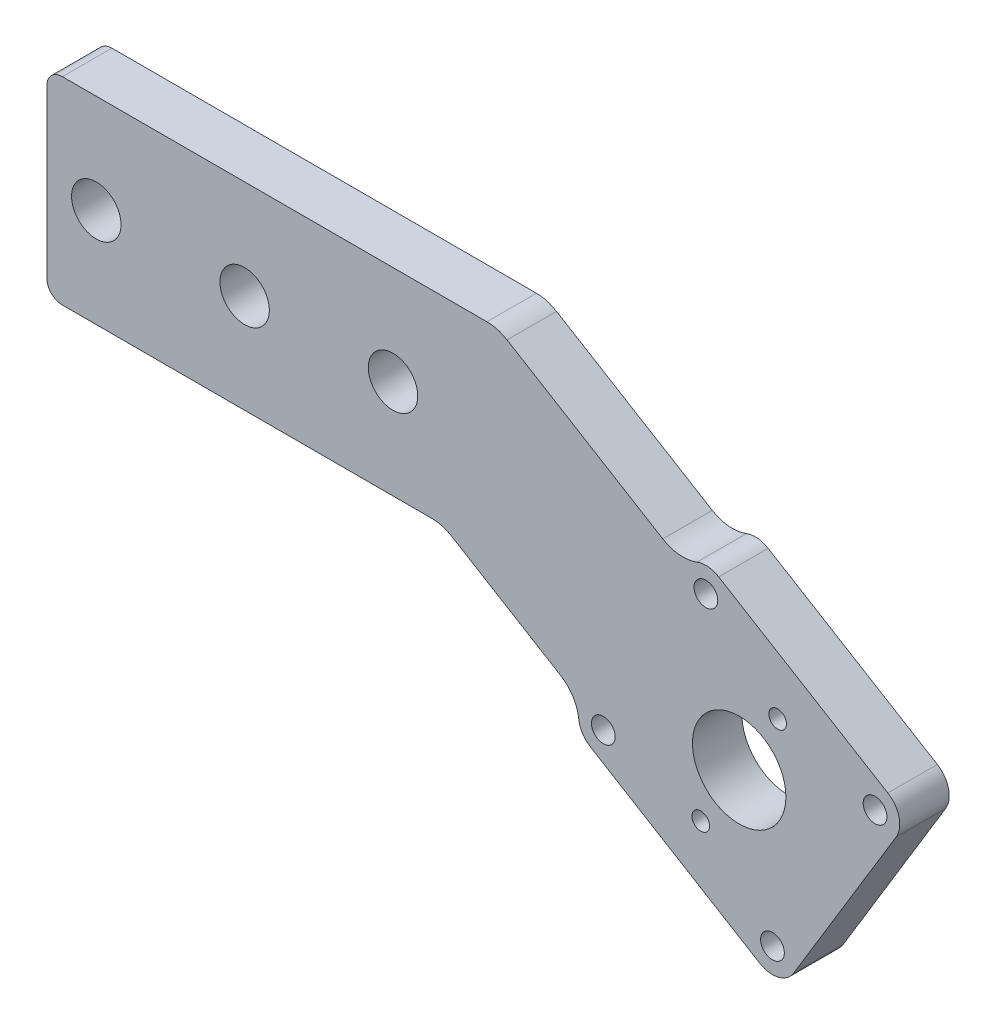
ISO-10303-21;
HEADER;
FILE_DESCRIPTION(('STEP AP214'),'2;1');
FILE_NAME('part.step','',(''),(''),'','','');
FILE_SCHEMA(('AUTOMOTIVE_DESIGN { 1 0 10303 214 1 1 1 1 }'));
ENDSEC;
DATA;
#1=APPLICATION_CONTEXT('core data for automotive mechanical design processes');
#2=APPLICATION_PROTOCOL_DEFINITION('international standard','automotive_design',2000,#1);
#3=PRODUCT_CONTEXT('',#1,'mechanical');
#4=PRODUCT('Part','Part','',(#3));
#5=PRODUCT_RELATED_PRODUCT_CATEGORY('part','',(#4));
#6=PRODUCT_DEFINITION_FORMATION('','',#4);
#7=PRODUCT_DEFINITION_CONTEXT('part definition',#1,'design');
#8=PRODUCT_DEFINITION('design','',#6,#7);
#9=PRODUCT_DEFINITION_SHAPE('','',#8);
#10=(LENGTH_UNIT() NAMED_UNIT(*) SI_UNIT(.MILLI.,.METRE.));
#11=(NAMED_UNIT(*) PLANE_ANGLE_UNIT() SI_UNIT($,.RADIAN.));
#12=(NAMED_UNIT(*) SI_UNIT($,.STERADIAN.) SOLID_ANGLE_UNIT());
#13=UNCERTAINTY_MEASURE_WITH_UNIT(LENGTH_MEASURE(1.E-05),#10,'distance_accuracy_value','');
#14=(GEOMETRIC_REPRESENTATION_CONTEXT(3) GLOBAL_UNCERTAINTY_ASSIGNED_CONTEXT((#13)) GLOBAL_UNIT_ASSIGNED_CONTEXT((#10,
#11,#12)) REPRESENTATION_CONTEXT('',''));
#15=CARTESIAN_POINT('',(0.,0.,0.));
#16=DIRECTION('',(0.,0.,1.));
#17=DIRECTION('',(1.,0.,0.));
#18=AXIS2_PLACEMENT_3D('',#15,#16,#17);
#19=CARTESIAN_POINT('',(33.8252466050733,-3.50561742529808,6.35));
#20=DIRECTION('',(0.,0.,1.));
#21=DIRECTION('',(1.,0.,0.));
#22=AXIS2_PLACEMENT_3D('',#19,#20,#21);
#23=PLANE('',#22);
#24=CARTESIAN_POINT('',(42.3747533949267,-38.3943825747018,6.35));
#25=DIRECTION('',(0.,0.,1.));
#26=DIRECTION('',(1.,0.,0.));
#27=AXIS2_PLACEMENT_3D('',#24,#25,#26);
#28=CIRCLE('',#27,1.52399999999997);
#29=CARTESIAN_POINT('',(43.8987533949267,-38.3943825747018,6.35));
#30=VERTEX_POINT('',#29);
#31=EDGE_CURVE('E354',#30,#30,#28,.T.);
#32=ORIENTED_EDGE('',*,*,#31,.F.);
#33=EDGE_LOOP('',(#32));
#34=FACE_BOUND('',#33,.T.);
#35=CARTESIAN_POINT('',(-44.45,0.,6.35));
#36=DIRECTION('',(0.,0.,1.));
#37=DIRECTION('',(1.,0.,0.));
#38=AXIS2_PLACEMENT_3D('',#35,#36,#37);
#39=CIRCLE('',#38,3.175);
#40=CARTESIAN_POINT('',(-41.275,0.,6.35));
#41=VERTEX_POINT('',#40);
#42=EDGE_CURVE('E342',#41,#41,#39,.T.);
#43=ORIENTED_EDGE('',*,*,#42,.F.);
#44=EDGE_LOOP('',(#43));
#45=FACE_BOUND('',#44,.T.);
#46=CARTESIAN_POINT('',(-6.35,0.,6.35));
#47=DIRECTION('',(0.,0.,1.));
#48=DIRECTION('',(1.,0.,0.));
#49=AXIS2_PLACEMENT_3D('',#46,#47,#48);
#50=CIRCLE('',#49,3.175);
#51=CARTESIAN_POINT('',(-3.17500000000001,0.,6.35));
#52=VERTEX_POINT('',#51);
#53=EDGE_CURVE('E330',#52,#52,#50,.T.);
#54=ORIENTED_EDGE('',*,*,#53,.F.);
#55=EDGE_LOOP('',(#54));
#56=FACE_BOUND('',#55,.T.);
#57=CARTESIAN_POINT('',(43.0386109424157,-12.8053240113892,6.35));
#58=DIRECTION('',(0.,0.,1.));
#59=DIRECTION('',(1.,0.,0.));
#60=AXIS2_PLACEMENT_3D('',#57,#58,#59);
#61=CIRCLE('',#60,1.13030000000011);
#62=CARTESIAN_POINT('',(44.1689109424158,-12.8053240113892,6.35));
#63=VERTEX_POINT('',#62);
#64=EDGE_CURVE('E318',#63,#63,#61,.T.);
#65=ORIENTED_EDGE('',*,*,#64,.F.);
#66=EDGE_LOOP('',(#65));
#67=FACE_BOUND('',#66,.T.);
#68=CARTESIAN_POINT('',(38.1,-20.95,6.35));
#69=DIRECTION('',(0.,0.,1.));
#70=DIRECTION('',(1.,0.,0.));
#71=AXIS2_PLACEMENT_3D('',#68,#69,#70);
#72=CIRCLE('',#71,6.);
#73=CARTESIAN_POINT('',(44.1,-20.95,6.35));
#74=VERTEX_POINT('',#73);
#75=EDGE_CURVE('E213',#74,#74,#72,.T.);
#76=ORIENTED_EDGE('',*,*,#75,.F.);
#77=EDGE_LOOP('',(#76));
#78=FACE_BOUND('',#77,.T.);
#79=DIRECTION('',(-0.855084093292464,0.518489337786425,0.));
#80=VECTOR('',#79,1.);
#81=CARTESIAN_POINT('',(31.1103546088691,-1.85941377782577,6.35));
#82=LINE('',#81,#80);
#83=CARTESIAN_POINT('',(28.2948534761296,-0.15220470996661,6.35));
#84=VERTEX_POINT('',#83);
#85=CARTESIAN_POINT('',(8.29417338104687,11.9754204664623,6.35));
#86=VERTEX_POINT('',#85);
#87=EDGE_CURVE('E170',#84,#86,#82,.T.);
#88=ORIENTED_EDGE('',*,*,#87,.T.);
#89=CARTESIAN_POINT('',(5.70172669211474,7.70000000000001,6.35));
#90=DIRECTION('',(0.,0.,1.));
#91=DIRECTION('',(1.,0.,0.));
#92=AXIS2_PLACEMENT_3D('',#89,#90,#91);
#93=CIRCLE('',#92,5.);
#94=CARTESIAN_POINT('',(5.70172669211474,12.7,6.35));
#95=VERTEX_POINT('',#94);
#96=EDGE_CURVE('E166',#86,#95,#93,.T.);
#97=ORIENTED_EDGE('',*,*,#96,.T.);
#98=DIRECTION('',(-1.,0.,0.));
#99=VECTOR('',#98,1.);
#100=CARTESIAN_POINT('',(7.0992087244958,12.7,6.35));
#101=LINE('',#100,#99);
#102=CARTESIAN_POINT('',(-48.8,12.7,6.35));
#103=VERTEX_POINT('',#102);
#104=EDGE_CURVE('E158',#95,#103,#101,.T.);
#105=ORIENTED_EDGE('',*,*,#104,.T.);
#106=CARTESIAN_POINT('',(-48.8,10.7,6.35));
#107=DIRECTION('',(0.,0.,1.));
#108=DIRECTION('',(1.,0.,0.));
#109=AXIS2_PLACEMENT_3D('',#106,#107,#108);
#110=CIRCLE('',#109,1.99999999999999);
#111=CARTESIAN_POINT('',(-50.8,10.7,6.35));
#112=VERTEX_POINT('',#111);
#113=EDGE_CURVE('E163',#103,#112,#110,.T.);
#114=ORIENTED_EDGE('',*,*,#113,.T.);
#115=DIRECTION('',(0.,-1.,0.));
#116=VECTOR('',#115,1.);
#117=CARTESIAN_POINT('',(-50.8,10.7,6.35));
#118=LINE('',#117,#116);
#119=CARTESIAN_POINT('',(-50.8,-10.7,6.35));
#120=VERTEX_POINT('',#119);
#121=EDGE_CURVE('E185',#112,#120,#118,.T.);
#122=ORIENTED_EDGE('',*,*,#121,.T.);
#123=CARTESIAN_POINT('',(-48.8,-10.7,6.35));
#124=DIRECTION('',(0.,0.,1.));
#125=DIRECTION('',(-1.,0.,0.));
#126=AXIS2_PLACEMENT_3D('',#123,#124,#125);
#127=CIRCLE('',#126,1.99999999999999);
#128=CARTESIAN_POINT('',(-48.8,-12.7,6.35));
#129=VERTEX_POINT('',#128);
#130=EDGE_CURVE('E187',#120,#129,#127,.T.);
#131=ORIENTED_EDGE('',*,*,#130,.T.);
#132=DIRECTION('',(1.,0.,0.));
#133=VECTOR('',#132,1.);
#134=CARTESIAN_POINT('',(-48.8,-12.7,6.35));
#135=LINE('',#134,#133);
#136=CARTESIAN_POINT('',(-1.39748203238105,-12.7,6.35));
#137=VERTEX_POINT('',#136);
#138=EDGE_CURVE('E192',#129,#137,#135,.T.);
#139=ORIENTED_EDGE('',*,*,#138,.T.);
#140=CARTESIAN_POINT('',(-1.39748203238106,-17.7,6.35));
#141=DIRECTION('',(0.,0.,1.));
#142=DIRECTION('',(1.,0.,0.));
#143=AXIS2_PLACEMENT_3D('',#140,#141,#142);
#144=CIRCLE('',#143,5.);
#145=CARTESIAN_POINT('',(1.19496465655107,-13.4245795335377,6.35));
#146=VERTEX_POINT('',#145);
#147=EDGE_CURVE('E288',#137,#146,#144,.F.);
#148=ORIENTED_EDGE('',*,*,#147,.T.);
#149=DIRECTION('',(0.855084093292463,-0.518489337786425,0.));
#150=VECTOR('',#149,1.);
#151=CARTESIAN_POINT('',(17.9407254290939,-23.5785497474544,6.35));
#152=LINE('',#151,#150);
#153=CARTESIAN_POINT('',(15.125224296355,-21.8713406795956,6.35));
#154=VERTEX_POINT('',#153);
#155=EDGE_CURVE('E195',#146,#154,#152,.T.);
#156=ORIENTED_EDGE('',*,*,#155,.T.);
#157=CARTESIAN_POINT('',(12.5327776074229,-26.1467611460579,6.35));
#158=DIRECTION('',(0.,0.,1.));
#159=DIRECTION('',(1.,0.,0.));
#160=AXIS2_PLACEMENT_3D('',#157,#158,#159);
#161=CIRCLE('',#160,5.);
#162=CARTESIAN_POINT('',(17.5008753553586,-25.5828420322162,6.35));
#163=VERTEX_POINT('',#162);
#164=EDGE_CURVE('E48',#154,#163,#161,.F.);
#165=ORIENTED_EDGE('',*,*,#164,.T.);
#166=CARTESIAN_POINT('',(20.6556174252981,-25.2247533949267,6.35));
#167=DIRECTION('',(0.,0.,1.));
#168=DIRECTION('',(-1.,0.,0.));
#169=AXIS2_PLACEMENT_3D('',#166,#167,#168);
#170=CIRCLE('',#169,3.17500000000037);
#171=CARTESIAN_POINT('',(19.0094142342208,-27.9396456678703,6.35));
#172=VERTEX_POINT('',#171);
#173=EDGE_CURVE('E197',#163,#172,#170,.T.);
#174=ORIENTED_EDGE('',*,*,#173,.T.);
#175=DIRECTION('',(0.855084093292464,-0.518489337786424,0.));
#176=VECTOR('',#175,1.);
#177=CARTESIAN_POINT('',(40.7285502038496,-41.1092748476451,6.35));
#178=LINE('',#177,#176);
#179=CARTESIAN_POINT('',(40.7285502038496,-41.1092748476451,6.35));
#180=VERTEX_POINT('',#179);
#181=EDGE_CURVE('E199',#172,#180,#178,.T.);
#182=ORIENTED_EDGE('',*,*,#181,.T.);
#183=CARTESIAN_POINT('',(42.3747533949267,-38.3943825747018,6.35));
#184=DIRECTION('',(0.,0.,1.));
#185=DIRECTION('',(-1.,0.,0.));
#186=AXIS2_PLACEMENT_3D('',#183,#184,#185);
#187=CIRCLE('',#186,3.17499999999999);
#188=CARTESIAN_POINT('',(45.0896455688839,-40.0405859290254,6.35));
#189=VERTEX_POINT('',#188);
#190=EDGE_CURVE('E201',#180,#189,#187,.T.);
#191=ORIENTED_EDGE('',*,*,#190,.T.);
#192=DIRECTION('',(0.518489337786426,0.855084093292463,0.));
#193=VECTOR('',#192,1.);
#194=CARTESIAN_POINT('',(58.2592747486591,-18.3214499593968,6.35));
#195=LINE('',#194,#193);
#196=CARTESIAN_POINT('',(58.2592747486591,-18.3214499593968,6.35));
#197=VERTEX_POINT('',#196);
#198=EDGE_CURVE('E203',#189,#197,#195,.T.);
#199=ORIENTED_EDGE('',*,*,#198,.T.);
#200=CARTESIAN_POINT('',(55.5443825747019,-16.6752466050732,6.35));
#201=DIRECTION('',(0.,0.,1.));
#202=DIRECTION('',(-1.,0.,0.));
#203=AXIS2_PLACEMENT_3D('',#200,#201,#202);
#204=CIRCLE('',#203,3.17500000000053);
#205=CARTESIAN_POINT('',(57.1905882999451,-13.9603558687489,6.35));
#206=VERTEX_POINT('',#205);
#207=EDGE_CURVE('E205',#197,#206,#204,.T.);
#208=ORIENTED_EDGE('',*,*,#207,.T.);
#209=DIRECTION('',(-0.855084093292463,0.518489337786426,0.));
#210=VECTOR('',#209,1.);
#211=CARTESIAN_POINT('',(57.1905882999454,-13.9603558687485,6.35));
#212=LINE('',#211,#210);
#213=CARTESIAN_POINT('',(35.4714523303168,-0.790726688973308,6.35));
#214=VERTEX_POINT('',#213);
#215=EDGE_CURVE('E207',#206,#214,#212,.T.);
#216=ORIENTED_EDGE('',*,*,#215,.T.);
#217=CARTESIAN_POINT('',(33.8252466050733,-3.50561742529808,6.35));
#218=DIRECTION('',(0.,0.,1.));
#219=DIRECTION('',(1.,0.,0.));
#220=AXIS2_PLACEMENT_3D('',#217,#218,#219);
#221=CIRCLE('',#220,3.17500000000088);
#222=CARTESIAN_POINT('',(32.6842093026833,-0.542737259891424,6.35));
#223=VERTEX_POINT('',#222);
#224=EDGE_CURVE('E241',#214,#223,#221,.T.);
#225=ORIENTED_EDGE('',*,*,#224,.T.);
#226=CARTESIAN_POINT('',(30.8873001650618,4.12321575649571,6.35));
#227=DIRECTION('',(0.,0.,1.));
#228=DIRECTION('',(1.,0.,0.));
#229=AXIS2_PLACEMENT_3D('',#226,#227,#228);
#230=CIRCLE('',#229,5.);
#231=EDGE_CURVE('E11',#223,#84,#230,.F.);
#232=ORIENTED_EDGE('',*,*,#231,.T.);
#233=EDGE_LOOP('',(#88,#97,#105,#114,#122,#131,#139,#148,#156,#165,#174,#182,#191,#199,#208,
#216,#225,#232));
#234=FACE_BOUND('',#233,.T.);
#235=CARTESIAN_POINT('',(33.8252466050733,-3.50561742529808,6.35));
#236=DIRECTION('',(0.,0.,1.));
#237=DIRECTION('',(1.,0.,0.));
#238=AXIS2_PLACEMENT_3D('',#235,#236,#237);
#239=CIRCLE('',#238,1.52400000000001);
#240=CARTESIAN_POINT('',(35.3492466050733,-3.50561742529808,6.35));
#241=VERTEX_POINT('',#240);
#242=EDGE_CURVE('E312',#241,#241,#239,.T.);
#243=ORIENTED_EDGE('',*,*,#242,.F.);
#244=EDGE_LOOP('',(#243));
#245=FACE_BOUND('',#244,.T.);
#246=CARTESIAN_POINT('',(33.1613890575843,-29.0946759886107,6.35));
#247=DIRECTION('',(0.,0.,1.));
#248=DIRECTION('',(1.,0.,0.));
#249=AXIS2_PLACEMENT_3D('',#246,#247,#248);
#250=CIRCLE('',#249,1.13030000000002);
#251=CARTESIAN_POINT('',(34.2916890575843,-29.0946759886107,6.35));
#252=VERTEX_POINT('',#251);
#253=EDGE_CURVE('E324',#252,#252,#250,.T.);
#254=ORIENTED_EDGE('',*,*,#253,.F.);
#255=EDGE_LOOP('',(#254));
#256=FACE_BOUND('',#255,.T.);
#257=CARTESIAN_POINT('',(-25.4,0.,6.35));
#258=DIRECTION('',(0.,0.,1.));
#259=DIRECTION('',(1.,0.,0.));
#260=AXIS2_PLACEMENT_3D('',#257,#258,#259);
#261=CIRCLE('',#260,3.175);
#262=CARTESIAN_POINT('',(-22.225,0.,6.35));
#263=VERTEX_POINT('',#262);
#264=EDGE_CURVE('E336',#263,#263,#261,.T.);
#265=ORIENTED_EDGE('',*,*,#264,.F.);
#266=EDGE_LOOP('',(#265));
#267=FACE_BOUND('',#266,.T.);
#268=CARTESIAN_POINT('',(20.6556174252981,-25.2247533949267,6.35));
#269=DIRECTION('',(0.,0.,1.));
#270=DIRECTION('',(1.,0.,0.));
#271=AXIS2_PLACEMENT_3D('',#268,#269,#270);
#272=CIRCLE('',#271,1.52399999999999);
#273=CARTESIAN_POINT('',(22.1796174252981,-25.2247533949267,6.35));
#274=VERTEX_POINT('',#273);
#275=EDGE_CURVE('E348',#274,#274,#272,.T.);
#276=ORIENTED_EDGE('',*,*,#275,.F.);
#277=EDGE_LOOP('',(#276));
#278=FACE_BOUND('',#277,.T.);
#279=CARTESIAN_POINT('',(55.5443825747019,-16.6752466050732,6.35));
#280=DIRECTION('',(0.,0.,1.));
#281=DIRECTION('',(1.,0.,0.));
#282=AXIS2_PLACEMENT_3D('',#279,#280,#281);
#283=CIRCLE('',#282,1.524);
#284=CARTESIAN_POINT('',(57.0683825747019,-16.6752466050732,6.35));
#285=VERTEX_POINT('',#284);
#286=EDGE_CURVE('E360',#285,#285,#283,.T.);
#287=ORIENTED_EDGE('',*,*,#286,.F.);
#288=EDGE_LOOP('',(#287));
#289=FACE_BOUND('',#288,.T.);
#290=ADVANCED_FACE('F33',(#34,#45,#56,#67,#78,#234,#245,#256,#267,#278,#289),#23,.T.);
#291=CARTESIAN_POINT('',(33.8252466050733,-3.50561742529808,0.));
#292=DIRECTION('',(0.,0.,1.));
#293=DIRECTION('',(1.,0.,0.));
#294=AXIS2_PLACEMENT_3D('',#291,#292,#293);
#295=PLANE('',#294);
#296=DIRECTION('',(-1.,0.,0.));
#297=VECTOR('',#296,1.);
#298=CARTESIAN_POINT('',(7.0992087244958,12.7,0.));
#299=LINE('',#298,#297);
#300=CARTESIAN_POINT('',(5.70172669211474,12.7,0.));
#301=VERTEX_POINT('',#300);
#302=CARTESIAN_POINT('',(-48.8,12.7,0.));
#303=VERTEX_POINT('',#302);
#304=EDGE_CURVE('E176',#301,#303,#299,.T.);
#305=ORIENTED_EDGE('',*,*,#304,.F.);
#306=CARTESIAN_POINT('',(5.70172669211474,7.70000000000001,0.));
#307=DIRECTION('',(0.,0.,1.));
#308=DIRECTION('',(1.,0.,0.));
#309=AXIS2_PLACEMENT_3D('',#306,#307,#308);
#310=CIRCLE('',#309,5.);
#311=CARTESIAN_POINT('',(8.29417338104687,11.9754204664623,0.));
#312=VERTEX_POINT('',#311);
#313=EDGE_CURVE('E274',#301,#312,#310,.F.);
#314=ORIENTED_EDGE('',*,*,#313,.T.);
#315=DIRECTION('',(-0.855084093292464,0.518489337786425,0.));
#316=VECTOR('',#315,1.);
#317=CARTESIAN_POINT('',(31.1103546088691,-1.85941377782577,0.));
#318=LINE('',#317,#316);
#319=CARTESIAN_POINT('',(28.2948534761296,-0.15220470996661,0.));
#320=VERTEX_POINT('',#319);
#321=EDGE_CURVE('E212',#320,#312,#318,.T.);
#322=ORIENTED_EDGE('',*,*,#321,.F.);
#323=CARTESIAN_POINT('',(30.8873001650618,4.12321575649571,0.));
#324=DIRECTION('',(0.,0.,1.));
#325=DIRECTION('',(1.,0.,0.));
#326=AXIS2_PLACEMENT_3D('',#323,#324,#325);
#327=CIRCLE('',#326,5.);
#328=CARTESIAN_POINT('',(32.6842093026833,-0.542737259891424,0.));
#329=VERTEX_POINT('',#328);
#330=EDGE_CURVE('E41',#320,#329,#327,.T.);
#331=ORIENTED_EDGE('',*,*,#330,.T.);
#332=CARTESIAN_POINT('',(33.8252466050733,-3.50561742529808,0.));
#333=DIRECTION('',(0.,0.,1.));
#334=DIRECTION('',(1.,0.,0.));
#335=AXIS2_PLACEMENT_3D('',#332,#333,#334);
#336=CIRCLE('',#335,3.17500000000088);
#337=CARTESIAN_POINT('',(35.4714523303168,-0.790726688973308,0.));
#338=VERTEX_POINT('',#337);
#339=EDGE_CURVE('E210',#338,#329,#336,.T.);
#340=ORIENTED_EDGE('',*,*,#339,.F.);
#341=DIRECTION('',(-0.855084093292463,0.518489337786426,0.));
#342=VECTOR('',#341,1.);
#343=CARTESIAN_POINT('',(57.1905882999454,-13.9603558687485,0.));
#344=LINE('',#343,#342);
#345=CARTESIAN_POINT('',(57.1905882999451,-13.9603558687489,0.));
#346=VERTEX_POINT('',#345);
#347=EDGE_CURVE('E239',#346,#338,#344,.T.);
#348=ORIENTED_EDGE('',*,*,#347,.F.);
#349=CARTESIAN_POINT('',(55.5443825747019,-16.6752466050732,0.));
#350=DIRECTION('',(0.,0.,1.));
#351=DIRECTION('',(-1.,0.,0.));
#352=AXIS2_PLACEMENT_3D('',#349,#350,#351);
#353=CIRCLE('',#352,3.17500000000053);
#354=CARTESIAN_POINT('',(58.2592747486591,-18.3214499593968,0.));
#355=VERTEX_POINT('',#354);
#356=EDGE_CURVE('E237',#355,#346,#353,.T.);
#357=ORIENTED_EDGE('',*,*,#356,.F.);
#358=DIRECTION('',(0.518489337786426,0.855084093292463,0.));
#359=VECTOR('',#358,1.);
#360=CARTESIAN_POINT('',(58.2592747486591,-18.3214499593968,0.));
#361=LINE('',#360,#359);
#362=CARTESIAN_POINT('',(45.0896455688839,-40.0405859290254,0.));
#363=VERTEX_POINT('',#362);
#364=EDGE_CURVE('E235',#363,#355,#361,.T.);
#365=ORIENTED_EDGE('',*,*,#364,.F.);
#366=CARTESIAN_POINT('',(42.3747533949267,-38.3943825747018,0.));
#367=DIRECTION('',(0.,0.,1.));
#368=DIRECTION('',(-1.,0.,0.));
#369=AXIS2_PLACEMENT_3D('',#366,#367,#368);
#370=CIRCLE('',#369,3.17499999999999);
#371=CARTESIAN_POINT('',(40.7285502038496,-41.1092748476451,0.));
#372=VERTEX_POINT('',#371);
#373=EDGE_CURVE('E233',#372,#363,#370,.T.);
#374=ORIENTED_EDGE('',*,*,#373,.F.);
#375=DIRECTION('',(0.855084093292464,-0.518489337786424,0.));
#376=VECTOR('',#375,1.);
#377=CARTESIAN_POINT('',(40.7285502038496,-41.1092748476451,0.));
#378=LINE('',#377,#376);
#379=CARTESIAN_POINT('',(19.0094142342208,-27.9396456678703,0.));
#380=VERTEX_POINT('',#379);
#381=EDGE_CURVE('E231',#380,#372,#378,.T.);
#382=ORIENTED_EDGE('',*,*,#381,.F.);
#383=CARTESIAN_POINT('',(20.6556174252981,-25.2247533949267,0.));
#384=DIRECTION('',(0.,0.,1.));
#385=DIRECTION('',(-1.,0.,0.));
#386=AXIS2_PLACEMENT_3D('',#383,#384,#385);
#387=CIRCLE('',#386,3.17500000000037);
#388=CARTESIAN_POINT('',(17.5008753553586,-25.5828420322162,0.));
#389=VERTEX_POINT('',#388);
#390=EDGE_CURVE('E229',#389,#380,#387,.T.);
#391=ORIENTED_EDGE('',*,*,#390,.F.);
#392=CARTESIAN_POINT('',(12.5327776074229,-26.1467611460579,0.));
#393=DIRECTION('',(0.,0.,1.));
#394=DIRECTION('',(1.,0.,0.));
#395=AXIS2_PLACEMENT_3D('',#392,#393,#394);
#396=CIRCLE('',#395,5.);
#397=CARTESIAN_POINT('',(15.125224296355,-21.8713406795956,0.));
#398=VERTEX_POINT('',#397);
#399=EDGE_CURVE('E290',#389,#398,#396,.T.);
#400=ORIENTED_EDGE('',*,*,#399,.T.);
#401=DIRECTION('',(0.855084093292463,-0.518489337786425,0.));
#402=VECTOR('',#401,1.);
#403=CARTESIAN_POINT('',(17.9407254290939,-23.5785497474544,0.));
#404=LINE('',#403,#402);
#405=CARTESIAN_POINT('',(1.19496465655107,-13.4245795335377,0.));
#406=VERTEX_POINT('',#405);
#407=EDGE_CURVE('E226',#406,#398,#404,.T.);
#408=ORIENTED_EDGE('',*,*,#407,.F.);
#409=CARTESIAN_POINT('',(-1.39748203238106,-17.7,0.));
#410=DIRECTION('',(0.,0.,1.));
#411=DIRECTION('',(1.,0.,0.));
#412=AXIS2_PLACEMENT_3D('',#409,#410,#411);
#413=CIRCLE('',#412,5.);
#414=CARTESIAN_POINT('',(-1.39748203238105,-12.7,0.));
#415=VERTEX_POINT('',#414);
#416=EDGE_CURVE('E286',#406,#415,#413,.T.);
#417=ORIENTED_EDGE('',*,*,#416,.T.);
#418=DIRECTION('',(1.,0.,0.));
#419=VECTOR('',#418,1.);
#420=CARTESIAN_POINT('',(-48.8,-12.7,0.));
#421=LINE('',#420,#419);
#422=CARTESIAN_POINT('',(-48.8,-12.7,0.));
#423=VERTEX_POINT('',#422);
#424=EDGE_CURVE('E223',#423,#415,#421,.T.);
#425=ORIENTED_EDGE('',*,*,#424,.F.);
#426=CARTESIAN_POINT('',(-48.8,-10.7,0.));
#427=DIRECTION('',(0.,0.,1.));
#428=DIRECTION('',(-1.,0.,0.));
#429=AXIS2_PLACEMENT_3D('',#426,#427,#428);
#430=CIRCLE('',#429,1.99999999999999);
#431=CARTESIAN_POINT('',(-50.8,-10.7,0.));
#432=VERTEX_POINT('',#431);
#433=EDGE_CURVE('E221',#432,#423,#430,.T.);
#434=ORIENTED_EDGE('',*,*,#433,.F.);
#435=DIRECTION('',(0.,-1.,0.));
#436=VECTOR('',#435,1.);
#437=CARTESIAN_POINT('',(-50.8,10.7,0.));
#438=LINE('',#437,#436);
#439=CARTESIAN_POINT('',(-50.8,10.7,0.));
#440=VERTEX_POINT('',#439);
#441=EDGE_CURVE('E219',#440,#432,#438,.T.);
#442=ORIENTED_EDGE('',*,*,#441,.F.);
#443=CARTESIAN_POINT('',(-48.8,10.7,0.));
#444=DIRECTION('',(0.,0.,1.));
#445=DIRECTION('',(1.,0.,0.));
#446=AXIS2_PLACEMENT_3D('',#443,#444,#445);
#447=CIRCLE('',#446,1.99999999999999);
#448=EDGE_CURVE('E217',#303,#440,#447,.T.);
#449=ORIENTED_EDGE('',*,*,#448,.F.);
#450=EDGE_LOOP('',(#305,#314,#322,#331,#340,#348,#357,#365,#374,#382,#391,#400,#408,#417,#425,
#434,#442,#449));
#451=FACE_BOUND('',#450,.T.);
#452=CARTESIAN_POINT('',(38.1,-20.95,0.));
#453=DIRECTION('',(0.,0.,1.));
#454=DIRECTION('',(1.,0.,0.));
#455=AXIS2_PLACEMENT_3D('',#452,#453,#454);
#456=CIRCLE('',#455,6.);
#457=CARTESIAN_POINT('',(44.1,-20.95,0.));
#458=VERTEX_POINT('',#457);
#459=EDGE_CURVE('E309',#458,#458,#456,.T.);
#460=ORIENTED_EDGE('',*,*,#459,.T.);
#461=EDGE_LOOP('',(#460));
#462=FACE_BOUND('',#461,.T.);
#463=CARTESIAN_POINT('',(33.8252466050733,-3.50561742529808,0.));
#464=DIRECTION('',(0.,0.,1.));
#465=DIRECTION('',(1.,0.,0.));
#466=AXIS2_PLACEMENT_3D('',#463,#464,#465);
#467=CIRCLE('',#466,1.52400000000001);
#468=CARTESIAN_POINT('',(35.3492466050733,-3.50561742529808,0.));
#469=VERTEX_POINT('',#468);
#470=EDGE_CURVE('E315',#469,#469,#467,.T.);
#471=ORIENTED_EDGE('',*,*,#470,.T.);
#472=EDGE_LOOP('',(#471));
#473=FACE_BOUND('',#472,.T.);
#474=CARTESIAN_POINT('',(43.0386109424157,-12.8053240113892,0.));
#475=DIRECTION('',(0.,0.,1.));
#476=DIRECTION('',(1.,0.,0.));
#477=AXIS2_PLACEMENT_3D('',#474,#475,#476);
#478=CIRCLE('',#477,1.13030000000011);
#479=CARTESIAN_POINT('',(44.1689109424158,-12.8053240113892,0.));
#480=VERTEX_POINT('',#479);
#481=EDGE_CURVE('E321',#480,#480,#478,.T.);
#482=ORIENTED_EDGE('',*,*,#481,.T.);
#483=EDGE_LOOP('',(#482));
#484=FACE_BOUND('',#483,.T.);
#485=CARTESIAN_POINT('',(33.1613890575843,-29.0946759886107,0.));
#486=DIRECTION('',(0.,0.,1.));
#487=DIRECTION('',(1.,0.,0.));
#488=AXIS2_PLACEMENT_3D('',#485,#486,#487);
#489=CIRCLE('',#488,1.13030000000002);
#490=CARTESIAN_POINT('',(34.2916890575843,-29.0946759886107,0.));
#491=VERTEX_POINT('',#490);
#492=EDGE_CURVE('E327',#491,#491,#489,.T.);
#493=ORIENTED_EDGE('',*,*,#492,.T.);
#494=EDGE_LOOP('',(#493));
#495=FACE_BOUND('',#494,.T.);
#496=CARTESIAN_POINT('',(-6.35,0.,0.));
#497=DIRECTION('',(0.,0.,1.));
#498=DIRECTION('',(1.,0.,0.));
#499=AXIS2_PLACEMENT_3D('',#496,#497,#498);
#500=CIRCLE('',#499,3.175);
#501=CARTESIAN_POINT('',(-3.17500000000001,0.,0.));
#502=VERTEX_POINT('',#501);
#503=EDGE_CURVE('E333',#502,#502,#500,.T.);
#504=ORIENTED_EDGE('',*,*,#503,.T.);
#505=EDGE_LOOP('',(#504));
#506=FACE_BOUND('',#505,.T.);
#507=CARTESIAN_POINT('',(-25.4,0.,0.));
#508=DIRECTION('',(0.,0.,1.));
#509=DIRECTION('',(1.,0.,0.));
#510=AXIS2_PLACEMENT_3D('',#507,#508,#509);
#511=CIRCLE('',#510,3.175);
#512=CARTESIAN_POINT('',(-22.225,0.,0.));
#513=VERTEX_POINT('',#512);
#514=EDGE_CURVE('E339',#513,#513,#511,.T.);
#515=ORIENTED_EDGE('',*,*,#514,.T.);
#516=EDGE_LOOP('',(#515));
#517=FACE_BOUND('',#516,.T.);
#518=CARTESIAN_POINT('',(-44.45,0.,0.));
#519=DIRECTION('',(0.,0.,1.));
#520=DIRECTION('',(1.,0.,0.));
#521=AXIS2_PLACEMENT_3D('',#518,#519,#520);
#522=CIRCLE('',#521,3.175);
#523=CARTESIAN_POINT('',(-41.275,0.,0.));
#524=VERTEX_POINT('',#523);
#525=EDGE_CURVE('E345',#524,#524,#522,.T.);
#526=ORIENTED_EDGE('',*,*,#525,.T.);
#527=EDGE_LOOP('',(#526));
#528=FACE_BOUND('',#527,.T.);
#529=CARTESIAN_POINT('',(20.6556174252981,-25.2247533949267,0.));
#530=DIRECTION('',(0.,0.,1.));
#531=DIRECTION('',(1.,0.,0.));
#532=AXIS2_PLACEMENT_3D('',#529,#530,#531);
#533=CIRCLE('',#532,1.52399999999999);
#534=CARTESIAN_POINT('',(22.1796174252981,-25.2247533949267,0.));
#535=VERTEX_POINT('',#534);
#536=EDGE_CURVE('E351',#535,#535,#533,.T.);
#537=ORIENTED_EDGE('',*,*,#536,.T.);
#538=EDGE_LOOP('',(#537));
#539=FACE_BOUND('',#538,.T.);
#540=CARTESIAN_POINT('',(42.3747533949267,-38.3943825747018,0.));
#541=DIRECTION('',(0.,0.,1.));
#542=DIRECTION('',(1.,0.,0.));
#543=AXIS2_PLACEMENT_3D('',#540,#541,#542);
#544=CIRCLE('',#543,1.52399999999997);
#545=CARTESIAN_POINT('',(43.8987533949267,-38.3943825747018,0.));
#546=VERTEX_POINT('',#545);
#547=EDGE_CURVE('E357',#546,#546,#544,.T.);
#548=ORIENTED_EDGE('',*,*,#547,.T.);
#549=EDGE_LOOP('',(#548));
#550=FACE_BOUND('',#549,.T.);
#551=CARTESIAN_POINT('',(55.5443825747019,-16.6752466050732,0.));
#552=DIRECTION('',(0.,0.,1.));
#553=DIRECTION('',(1.,0.,0.));
#554=AXIS2_PLACEMENT_3D('',#551,#552,#553);
#555=CIRCLE('',#554,1.524);
#556=CARTESIAN_POINT('',(57.0683825747019,-16.6752466050732,0.));
#557=VERTEX_POINT('',#556);
#558=EDGE_CURVE('E363',#557,#557,#555,.T.);
#559=ORIENTED_EDGE('',*,*,#558,.T.);
#560=EDGE_LOOP('',(#559));
#561=FACE_BOUND('',#560,.T.);
#562=ADVANCED_FACE('F295',(#451,#462,#473,#484,#495,#506,#517,#528,#539,#550,#561),#295,.F.);
#563=CARTESIAN_POINT('',(33.8252466050733,-3.50561742529808,6.35));
#564=DIRECTION('',(0.,0.,-1.));
#565=DIRECTION('',(-1.,0.,0.));
#566=AXIS2_PLACEMENT_3D('',#563,#564,#565);
#567=CYLINDRICAL_SURFACE('',#566,3.17500000000088);
#568=ORIENTED_EDGE('',*,*,#339,.T.);
#569=DIRECTION('',(0.,0.,-1.));
#570=VECTOR('',#569,1.);
#571=CARTESIAN_POINT('',(32.6842093026833,-0.542737259891424,6.35));
#572=LINE('',#571,#570);
#573=EDGE_CURVE('E56',#329,#223,#572,.F.);
#574=ORIENTED_EDGE('',*,*,#573,.T.);
#575=ORIENTED_EDGE('',*,*,#224,.F.);
#576=DIRECTION('',(0.,0.,-1.));
#577=VECTOR('',#576,1.);
#578=CARTESIAN_POINT('',(35.4714523303168,-0.790726688973308,6.35));
#579=LINE('',#578,#577);
#580=EDGE_CURVE('E209',#214,#338,#579,.T.);
#581=ORIENTED_EDGE('',*,*,#580,.T.);
#582=EDGE_LOOP('',(#568,#574,#575,#581));
#583=FACE_BOUND('',#582,.T.);
#584=ADVANCED_FACE('F300',(#583),#567,.T.);
#585=CARTESIAN_POINT('',(31.1103546088691,-1.85941377782577,6.35));
#586=DIRECTION('',(-0.518489337786425,-0.855084093292464,0.));
#587=DIRECTION('',(0.855084093292464,-0.518489337786425,0.));
#588=AXIS2_PLACEMENT_3D('',#585,#586,#587);
#589=PLANE('',#588);
#590=ORIENTED_EDGE('',*,*,#321,.T.);
#591=DIRECTION('',(0.,0.,-1.));
#592=VECTOR('',#591,1.);
#593=CARTESIAN_POINT('',(8.29417338104687,11.9754204664623,6.35));
#594=LINE('',#593,#592);
#595=EDGE_CURVE('E279',#312,#86,#594,.F.);
#596=ORIENTED_EDGE('',*,*,#595,.T.);
#597=ORIENTED_EDGE('',*,*,#87,.F.);
#598=DIRECTION('',(0.,0.,1.));
#599=VECTOR('',#598,1.);
#600=CARTESIAN_POINT('',(28.2948534761296,-0.152204709966608,0.));
#601=LINE('',#600,#599);
#602=EDGE_CURVE('E276',#84,#320,#601,.F.);
#603=ORIENTED_EDGE('',*,*,#602,.T.);
#604=EDGE_LOOP('',(#590,#596,#597,#603));
#605=FACE_BOUND('',#604,.T.);
#606=ADVANCED_FACE('F305',(#605),#589,.F.);
#607=CARTESIAN_POINT('',(7.0992087244958,12.7,6.35));
#608=DIRECTION('',(0.,-1.,0.));
#609=DIRECTION('',(0.,0.,-1.));
#610=AXIS2_PLACEMENT_3D('',#607,#608,#609);
#611=PLANE('',#610);
#612=ORIENTED_EDGE('',*,*,#104,.F.);
#613=DIRECTION('',(0.,0.,-1.));
#614=VECTOR('',#613,1.);
#615=CARTESIAN_POINT('',(5.70172669211474,12.7,6.35));
#616=LINE('',#615,#614);
#617=EDGE_CURVE('E272',#95,#301,#616,.T.);
#618=ORIENTED_EDGE('',*,*,#617,.T.);
#619=ORIENTED_EDGE('',*,*,#304,.T.);
#620=DIRECTION('',(0.,0.,-1.));
#621=VECTOR('',#620,1.);
#622=CARTESIAN_POINT('',(-48.8,12.7,6.35));
#623=LINE('',#622,#621);
#624=EDGE_CURVE('E173',#103,#303,#623,.T.);
#625=ORIENTED_EDGE('',*,*,#624,.F.);
#626=EDGE_LOOP('',(#612,#618,#619,#625));
#627=FACE_BOUND('',#626,.T.);
#628=ADVANCED_FACE('F174',(#627),#611,.F.);
#629=CARTESIAN_POINT('',(-48.8,10.7,6.35));
#630=DIRECTION('',(0.,0.,-1.));
#631=DIRECTION('',(-1.,0.,0.));
#632=AXIS2_PLACEMENT_3D('',#629,#630,#631);
#633=CYLINDRICAL_SURFACE('',#632,1.99999999999999);
#634=ORIENTED_EDGE('',*,*,#448,.T.);
#635=DIRECTION('',(0.,0.,-1.));
#636=VECTOR('',#635,1.);
#637=CARTESIAN_POINT('',(-50.8,10.7,6.35));
#638=LINE('',#637,#636);
#639=EDGE_CURVE('E180',#112,#440,#638,.T.);
#640=ORIENTED_EDGE('',*,*,#639,.F.);
#641=ORIENTED_EDGE('',*,*,#113,.F.);
#642=ORIENTED_EDGE('',*,*,#624,.T.);
#643=EDGE_LOOP('',(#634,#640,#641,#642));
#644=FACE_BOUND('',#643,.T.);
#645=ADVANCED_FACE('F182',(#644),#633,.T.);
#646=CARTESIAN_POINT('',(-50.8,10.7,6.35));
#647=DIRECTION('',(1.,0.,0.));
#648=DIRECTION('',(0.,1.,0.));
#649=AXIS2_PLACEMENT_3D('',#646,#647,#648);
#650=PLANE('',#649);
#651=ORIENTED_EDGE('',*,*,#441,.T.);
#652=DIRECTION('',(0.,0.,-1.));
#653=VECTOR('',#652,1.);
#654=CARTESIAN_POINT('',(-50.8,-10.7,6.35));
#655=LINE('',#654,#653);
#656=EDGE_CURVE('E262',#120,#432,#655,.T.);
#657=ORIENTED_EDGE('',*,*,#656,.F.);
#658=ORIENTED_EDGE('',*,*,#121,.F.);
#659=ORIENTED_EDGE('',*,*,#639,.T.);
#660=EDGE_LOOP('',(#651,#657,#658,#659));
#661=FACE_BOUND('',#660,.T.);
#662=ADVANCED_FACE('F421',(#661),#650,.F.);
#663=CARTESIAN_POINT('',(-48.8,-10.7,6.35));
#664=DIRECTION('',(0.,0.,-1.));
#665=DIRECTION('',(-1.,0.,0.));
#666=AXIS2_PLACEMENT_3D('',#663,#664,#665);
#667=CYLINDRICAL_SURFACE('',#666,1.99999999999999);
#668=ORIENTED_EDGE('',*,*,#433,.T.);
#669=DIRECTION('',(0.,0.,-1.));
#670=VECTOR('',#669,1.);
#671=CARTESIAN_POINT('',(-48.8,-12.7,6.35));
#672=LINE('',#671,#670);
#673=EDGE_CURVE('E259',#129,#423,#672,.T.);
#674=ORIENTED_EDGE('',*,*,#673,.F.);
#675=ORIENTED_EDGE('',*,*,#130,.F.);
#676=ORIENTED_EDGE('',*,*,#656,.T.);
#677=EDGE_LOOP('',(#668,#674,#675,#676));
#678=FACE_BOUND('',#677,.T.);
#679=ADVANCED_FACE('F417',(#678),#667,.T.);
#680=CARTESIAN_POINT('',(-48.8,-12.7,6.35));
#681=DIRECTION('',(0.,1.,0.));
#682=DIRECTION('',(-1.,0.,0.));
#683=AXIS2_PLACEMENT_3D('',#680,#681,#682);
#684=PLANE('',#683);
#685=ORIENTED_EDGE('',*,*,#424,.T.);
#686=DIRECTION('',(0.,0.,-1.));
#687=VECTOR('',#686,1.);
#688=CARTESIAN_POINT('',(-1.39748203238106,-12.7,6.35));
#689=LINE('',#688,#687);
#690=EDGE_CURVE('E270',#415,#137,#689,.F.);
#691=ORIENTED_EDGE('',*,*,#690,.T.);
#692=ORIENTED_EDGE('',*,*,#138,.F.);
#693=ORIENTED_EDGE('',*,*,#673,.T.);
#694=EDGE_LOOP('',(#685,#691,#692,#693));
#695=FACE_BOUND('',#694,.T.);
#696=ADVANCED_FACE('F413',(#695),#684,.F.);
#697=CARTESIAN_POINT('',(17.9407254290939,-23.5785497474544,6.35));
#698=DIRECTION('',(0.518489337786425,0.855084093292463,0.));
#699=DIRECTION('',(-0.855084093292463,0.518489337786425,0.));
#700=AXIS2_PLACEMENT_3D('',#697,#698,#699);
#701=PLANE('',#700);
#702=ORIENTED_EDGE('',*,*,#155,.F.);
#703=DIRECTION('',(0.,0.,-1.));
#704=VECTOR('',#703,1.);
#705=CARTESIAN_POINT('',(1.19496465655107,-13.4245795335377,0.));
#706=LINE('',#705,#704);
#707=EDGE_CURVE('E267',#146,#406,#706,.T.);
#708=ORIENTED_EDGE('',*,*,#707,.T.);
#709=ORIENTED_EDGE('',*,*,#407,.T.);
#710=DIRECTION('',(0.,0.,1.));
#711=VECTOR('',#710,1.);
#712=CARTESIAN_POINT('',(15.125224296355,-21.8713406795956,6.35));
#713=LINE('',#712,#711);
#714=EDGE_CURVE('E179',#398,#154,#713,.T.);
#715=ORIENTED_EDGE('',*,*,#714,.T.);
#716=EDGE_LOOP('',(#702,#708,#709,#715));
#717=FACE_BOUND('',#716,.T.);
#718=ADVANCED_FACE('F409',(#717),#701,.F.);
#719=CARTESIAN_POINT('',(20.6556174252981,-25.2247533949267,6.35));
#720=DIRECTION('',(0.,0.,-1.));
#721=DIRECTION('',(-1.,0.,0.));
#722=AXIS2_PLACEMENT_3D('',#719,#720,#721);
#723=CYLINDRICAL_SURFACE('',#722,3.17500000000037);
#724=ORIENTED_EDGE('',*,*,#173,.F.);
#725=DIRECTION('',(0.,0.,-1.));
#726=VECTOR('',#725,1.);
#727=CARTESIAN_POINT('',(17.5008753553586,-25.5828420322162,6.35));
#728=LINE('',#727,#726);
#729=EDGE_CURVE('E282',#163,#389,#728,.T.);
#730=ORIENTED_EDGE('',*,*,#729,.T.);
#731=ORIENTED_EDGE('',*,*,#390,.T.);
#732=DIRECTION('',(0.,0.,-1.));
#733=VECTOR('',#732,1.);
#734=CARTESIAN_POINT('',(19.0094142342208,-27.9396456678703,6.35));
#735=LINE('',#734,#733);
#736=EDGE_CURVE('E256',#172,#380,#735,.T.);
#737=ORIENTED_EDGE('',*,*,#736,.F.);
#738=EDGE_LOOP('',(#724,#730,#731,#737));
#739=FACE_BOUND('',#738,.T.);
#740=ADVANCED_FACE('F405',(#739),#723,.T.);
#741=CARTESIAN_POINT('',(40.7285502038496,-41.1092748476451,6.35));
#742=DIRECTION('',(0.518489337786424,0.855084093292464,0.));
#743=DIRECTION('',(-0.855084093292464,0.518489337786424,0.));
#744=AXIS2_PLACEMENT_3D('',#741,#742,#743);
#745=PLANE('',#744);
#746=ORIENTED_EDGE('',*,*,#381,.T.);
#747=DIRECTION('',(0.,0.,-1.));
#748=VECTOR('',#747,1.);
#749=CARTESIAN_POINT('',(40.7285502038496,-41.1092748476451,6.35));
#750=LINE('',#749,#748);
#751=EDGE_CURVE('E253',#180,#372,#750,.T.);
#752=ORIENTED_EDGE('',*,*,#751,.F.);
#753=ORIENTED_EDGE('',*,*,#181,.F.);
#754=ORIENTED_EDGE('',*,*,#736,.T.);
#755=EDGE_LOOP('',(#746,#752,#753,#754));
#756=FACE_BOUND('',#755,.T.);
#757=ADVANCED_FACE('F401',(#756),#745,.F.);
#758=CARTESIAN_POINT('',(42.3747533949267,-38.3943825747018,6.35));
#759=DIRECTION('',(0.,0.,-1.));
#760=DIRECTION('',(-1.,0.,0.));
#761=AXIS2_PLACEMENT_3D('',#758,#759,#760);
#762=CYLINDRICAL_SURFACE('',#761,3.17499999999999);
#763=ORIENTED_EDGE('',*,*,#373,.T.);
#764=DIRECTION('',(0.,0.,-1.));
#765=VECTOR('',#764,1.);
#766=CARTESIAN_POINT('',(45.0896455688839,-40.0405859290254,6.35));
#767=LINE('',#766,#765);
#768=EDGE_CURVE('E250',#189,#363,#767,.T.);
#769=ORIENTED_EDGE('',*,*,#768,.F.);
#770=ORIENTED_EDGE('',*,*,#190,.F.);
#771=ORIENTED_EDGE('',*,*,#751,.T.);
#772=EDGE_LOOP('',(#763,#769,#770,#771));
#773=FACE_BOUND('',#772,.T.);
#774=ADVANCED_FACE('F397',(#773),#762,.T.);
#775=CARTESIAN_POINT('',(58.2592747486591,-18.3214499593968,6.35));
#776=DIRECTION('',(-0.855084093292463,0.518489337786426,0.));
#777=DIRECTION('',(-0.518489337786426,-0.855084093292463,0.));
#778=AXIS2_PLACEMENT_3D('',#775,#776,#777);
#779=PLANE('',#778);
#780=ORIENTED_EDGE('',*,*,#364,.T.);
#781=DIRECTION('',(0.,0.,-1.));
#782=VECTOR('',#781,1.);
#783=CARTESIAN_POINT('',(58.2592747486591,-18.3214499593968,6.35));
#784=LINE('',#783,#782);
#785=EDGE_CURVE('E247',#197,#355,#784,.T.);
#786=ORIENTED_EDGE('',*,*,#785,.F.);
#787=ORIENTED_EDGE('',*,*,#198,.F.);
#788=ORIENTED_EDGE('',*,*,#768,.T.);
#789=EDGE_LOOP('',(#780,#786,#787,#788));
#790=FACE_BOUND('',#789,.T.);
#791=ADVANCED_FACE('F393',(#790),#779,.F.);
#792=CARTESIAN_POINT('',(55.5443825747019,-16.6752466050732,6.35));
#793=DIRECTION('',(0.,0.,-1.));
#794=DIRECTION('',(-1.,0.,0.));
#795=AXIS2_PLACEMENT_3D('',#792,#793,#794);
#796=CYLINDRICAL_SURFACE('',#795,3.17500000000053);
#797=ORIENTED_EDGE('',*,*,#356,.T.);
#798=DIRECTION('',(0.,0.,-1.));
#799=VECTOR('',#798,1.);
#800=CARTESIAN_POINT('',(57.1905882999451,-13.9603558687489,6.35));
#801=LINE('',#800,#799);
#802=EDGE_CURVE('E244',#206,#346,#801,.T.);
#803=ORIENTED_EDGE('',*,*,#802,.F.);
#804=ORIENTED_EDGE('',*,*,#207,.F.);
#805=ORIENTED_EDGE('',*,*,#785,.T.);
#806=EDGE_LOOP('',(#797,#803,#804,#805));
#807=FACE_BOUND('',#806,.T.);
#808=ADVANCED_FACE('F389',(#807),#796,.T.);
#809=CARTESIAN_POINT('',(57.1905882999454,-13.9603558687485,6.35));
#810=DIRECTION('',(-0.518489337786426,-0.855084093292463,0.));
#811=DIRECTION('',(0.855084093292463,-0.518489337786426,0.));
#812=AXIS2_PLACEMENT_3D('',#809,#810,#811);
#813=PLANE('',#812);
#814=ORIENTED_EDGE('',*,*,#347,.T.);
#815=ORIENTED_EDGE('',*,*,#580,.F.);
#816=ORIENTED_EDGE('',*,*,#215,.F.);
#817=ORIENTED_EDGE('',*,*,#802,.T.);
#818=EDGE_LOOP('',(#814,#815,#816,#817));
#819=FACE_BOUND('',#818,.T.);
#820=ADVANCED_FACE('F386',(#819),#813,.F.);
#821=CARTESIAN_POINT('',(38.1,-20.95,6.35));
#822=DIRECTION('',(0.,0.,-1.));
#823=DIRECTION('',(-1.,0.,0.));
#824=AXIS2_PLACEMENT_3D('',#821,#822,#823);
#825=CYLINDRICAL_SURFACE('',#824,6.);
#826=ORIENTED_EDGE('',*,*,#75,.T.);
#827=EDGE_LOOP('',(#826));
#828=FACE_BOUND('',#827,.T.);
#829=ORIENTED_EDGE('',*,*,#459,.F.);
#830=EDGE_LOOP('',(#829));
#831=FACE_BOUND('',#830,.T.);
#832=ADVANCED_FACE('F383',(#828,#831),#825,.F.);
#833=CARTESIAN_POINT('',(33.8252466050733,-3.50561742529808,6.35));
#834=DIRECTION('',(0.,0.,-1.));
#835=DIRECTION('',(-1.,0.,0.));
#836=AXIS2_PLACEMENT_3D('',#833,#834,#835);
#837=CYLINDRICAL_SURFACE('',#836,1.52400000000001);
#838=ORIENTED_EDGE('',*,*,#242,.T.);
#839=EDGE_LOOP('',(#838));
#840=FACE_BOUND('',#839,.T.);
#841=ORIENTED_EDGE('',*,*,#470,.F.);
#842=EDGE_LOOP('',(#841));
#843=FACE_BOUND('',#842,.T.);
#844=ADVANCED_FACE('F592',(#840,#843),#837,.F.);
#845=CARTESIAN_POINT('',(43.0386109424157,-12.8053240113892,6.35));
#846=DIRECTION('',(0.,0.,-1.));
#847=DIRECTION('',(-1.,0.,0.));
#848=AXIS2_PLACEMENT_3D('',#845,#846,#847);
#849=CYLINDRICAL_SURFACE('',#848,1.13030000000011);
#850=ORIENTED_EDGE('',*,*,#64,.T.);
#851=EDGE_LOOP('',(#850));
#852=FACE_BOUND('',#851,.T.);
#853=ORIENTED_EDGE('',*,*,#481,.F.);
#854=EDGE_LOOP('',(#853));
#855=FACE_BOUND('',#854,.T.);
#856=ADVANCED_FACE('F600',(#852,#855),#849,.F.);
#857=CARTESIAN_POINT('',(33.1613890575843,-29.0946759886107,6.35));
#858=DIRECTION('',(0.,0.,-1.));
#859=DIRECTION('',(-1.,0.,0.));
#860=AXIS2_PLACEMENT_3D('',#857,#858,#859);
#861=CYLINDRICAL_SURFACE('',#860,1.13030000000002);
#862=ORIENTED_EDGE('',*,*,#253,.T.);
#863=EDGE_LOOP('',(#862));
#864=FACE_BOUND('',#863,.T.);
#865=ORIENTED_EDGE('',*,*,#492,.F.);
#866=EDGE_LOOP('',(#865));
#867=FACE_BOUND('',#866,.T.);
#868=ADVANCED_FACE('F608',(#864,#867),#861,.F.);
#869=CARTESIAN_POINT('',(-6.35,0.,6.35));
#870=DIRECTION('',(0.,0.,-1.));
#871=DIRECTION('',(-1.,0.,0.));
#872=AXIS2_PLACEMENT_3D('',#869,#870,#871);
#873=CYLINDRICAL_SURFACE('',#872,3.175);
#874=ORIENTED_EDGE('',*,*,#53,.T.);
#875=EDGE_LOOP('',(#874));
#876=FACE_BOUND('',#875,.T.);
#877=ORIENTED_EDGE('',*,*,#503,.F.);
#878=EDGE_LOOP('',(#877));
#879=FACE_BOUND('',#878,.T.);
#880=ADVANCED_FACE('F617',(#876,#879),#873,.F.);
#881=CARTESIAN_POINT('',(-25.4,0.,6.35));
#882=DIRECTION('',(0.,0.,-1.));
#883=DIRECTION('',(-1.,0.,0.));
#884=AXIS2_PLACEMENT_3D('',#881,#882,#883);
#885=CYLINDRICAL_SURFACE('',#884,3.175);
#886=ORIENTED_EDGE('',*,*,#264,.T.);
#887=EDGE_LOOP('',(#886));
#888=FACE_BOUND('',#887,.T.);
#889=ORIENTED_EDGE('',*,*,#514,.F.);
#890=EDGE_LOOP('',(#889));
#891=FACE_BOUND('',#890,.T.);
#892=ADVANCED_FACE('F626',(#888,#891),#885,.F.);
#893=CARTESIAN_POINT('',(-44.45,0.,6.35));
#894=DIRECTION('',(0.,0.,-1.));
#895=DIRECTION('',(-1.,0.,0.));
#896=AXIS2_PLACEMENT_3D('',#893,#894,#895);
#897=CYLINDRICAL_SURFACE('',#896,3.175);
#898=ORIENTED_EDGE('',*,*,#42,.T.);
#899=EDGE_LOOP('',(#898));
#900=FACE_BOUND('',#899,.T.);
#901=ORIENTED_EDGE('',*,*,#525,.F.);
#902=EDGE_LOOP('',(#901));
#903=FACE_BOUND('',#902,.T.);
#904=ADVANCED_FACE('F635',(#900,#903),#897,.F.);
#905=CARTESIAN_POINT('',(20.6556174252981,-25.2247533949267,6.35));
#906=DIRECTION('',(0.,0.,-1.));
#907=DIRECTION('',(-1.,0.,0.));
#908=AXIS2_PLACEMENT_3D('',#905,#906,#907);
#909=CYLINDRICAL_SURFACE('',#908,1.52399999999999);
#910=ORIENTED_EDGE('',*,*,#275,.T.);
#911=EDGE_LOOP('',(#910));
#912=FACE_BOUND('',#911,.T.);
#913=ORIENTED_EDGE('',*,*,#536,.F.);
#914=EDGE_LOOP('',(#913));
#915=FACE_BOUND('',#914,.T.);
#916=ADVANCED_FACE('F644',(#912,#915),#909,.F.);
#917=CARTESIAN_POINT('',(42.3747533949267,-38.3943825747018,6.35));
#918=DIRECTION('',(0.,0.,-1.));
#919=DIRECTION('',(-1.,0.,0.));
#920=AXIS2_PLACEMENT_3D('',#917,#918,#919);
#921=CYLINDRICAL_SURFACE('',#920,1.52399999999997);
#922=ORIENTED_EDGE('',*,*,#31,.T.);
#923=EDGE_LOOP('',(#922));
#924=FACE_BOUND('',#923,.T.);
#925=ORIENTED_EDGE('',*,*,#547,.F.);
#926=EDGE_LOOP('',(#925));
#927=FACE_BOUND('',#926,.T.);
#928=ADVANCED_FACE('F653',(#924,#927),#921,.F.);
#929=CARTESIAN_POINT('',(55.5443825747019,-16.6752466050732,6.35));
#930=DIRECTION('',(0.,0.,-1.));
#931=DIRECTION('',(-1.,0.,0.));
#932=AXIS2_PLACEMENT_3D('',#929,#930,#931);
#933=CYLINDRICAL_SURFACE('',#932,1.524);
#934=ORIENTED_EDGE('',*,*,#286,.T.);
#935=EDGE_LOOP('',(#934));
#936=FACE_BOUND('',#935,.T.);
#937=ORIENTED_EDGE('',*,*,#558,.F.);
#938=EDGE_LOOP('',(#937));
#939=FACE_BOUND('',#938,.T.);
#940=ADVANCED_FACE('F369',(#936,#939),#933,.F.);
#941=CARTESIAN_POINT('',(-1.39748203238106,-17.7,6.35));
#942=DIRECTION('',(0.,0.,1.));
#943=DIRECTION('',(1.,0.,0.));
#944=AXIS2_PLACEMENT_3D('',#941,#942,#943);
#945=CYLINDRICAL_SURFACE('',#944,5.);
#946=ORIENTED_EDGE('',*,*,#147,.F.);
#947=ORIENTED_EDGE('',*,*,#690,.F.);
#948=ORIENTED_EDGE('',*,*,#416,.F.);
#949=ORIENTED_EDGE('',*,*,#707,.F.);
#950=EDGE_LOOP('',(#946,#947,#948,#949));
#951=FACE_BOUND('',#950,.T.);
#952=ADVANCED_FACE('F434',(#951),#945,.F.);
#953=CARTESIAN_POINT('',(5.70172669211474,7.70000000000001,6.35));
#954=DIRECTION('',(0.,0.,-1.));
#955=DIRECTION('',(-1.,0.,0.));
#956=AXIS2_PLACEMENT_3D('',#953,#954,#955);
#957=CYLINDRICAL_SURFACE('',#956,5.);
#958=ORIENTED_EDGE('',*,*,#96,.F.);
#959=ORIENTED_EDGE('',*,*,#595,.F.);
#960=ORIENTED_EDGE('',*,*,#313,.F.);
#961=ORIENTED_EDGE('',*,*,#617,.F.);
#962=EDGE_LOOP('',(#958,#959,#960,#961));
#963=FACE_BOUND('',#962,.T.);
#964=ADVANCED_FACE('F437',(#963),#957,.T.);
#965=CARTESIAN_POINT('',(12.5327776074229,-26.1467611460579,6.35));
#966=DIRECTION('',(0.,0.,-1.));
#967=DIRECTION('',(-1.,0.,0.));
#968=AXIS2_PLACEMENT_3D('',#965,#966,#967);
#969=CYLINDRICAL_SURFACE('',#968,5.);
#970=ORIENTED_EDGE('',*,*,#164,.F.);
#971=ORIENTED_EDGE('',*,*,#714,.F.);
#972=ORIENTED_EDGE('',*,*,#399,.F.);
#973=ORIENTED_EDGE('',*,*,#729,.F.);
#974=EDGE_LOOP('',(#970,#971,#972,#973));
#975=FACE_BOUND('',#974,.T.);
#976=ADVANCED_FACE('F440',(#975),#969,.F.);
#977=CARTESIAN_POINT('',(30.8873001650618,4.12321575649571,6.35));
#978=DIRECTION('',(0.,0.,-1.));
#979=DIRECTION('',(-1.,0.,0.));
#980=AXIS2_PLACEMENT_3D('',#977,#978,#979);
#981=CYLINDRICAL_SURFACE('',#980,5.);
#982=ORIENTED_EDGE('',*,*,#231,.F.);
#983=ORIENTED_EDGE('',*,*,#573,.F.);
#984=ORIENTED_EDGE('',*,*,#330,.F.);
#985=ORIENTED_EDGE('',*,*,#602,.F.);
#986=EDGE_LOOP('',(#982,#983,#984,#985));
#987=FACE_BOUND('',#986,.T.);
#988=ADVANCED_FACE('F35',(#987),#981,.F.);
#989=CLOSED_SHELL('',(#290,#562,#584,#606,#628,#645,#662,#679,#696,#718,#740,#757,#774,#791,
#808,#820,#832,#844,#856,#868,#880,#892,#904,#916,#928,#940,#952,#964,#976,#988));
#990=MANIFOLD_SOLID_BREP('B2',#989);
#991=ADVANCED_BREP_SHAPE_REPRESENTATION('',(#18,#990),#14);
#992=SHAPE_DEFINITION_REPRESENTATION(#9,#991);
ENDSEC;
END-ISO-10303-21;
